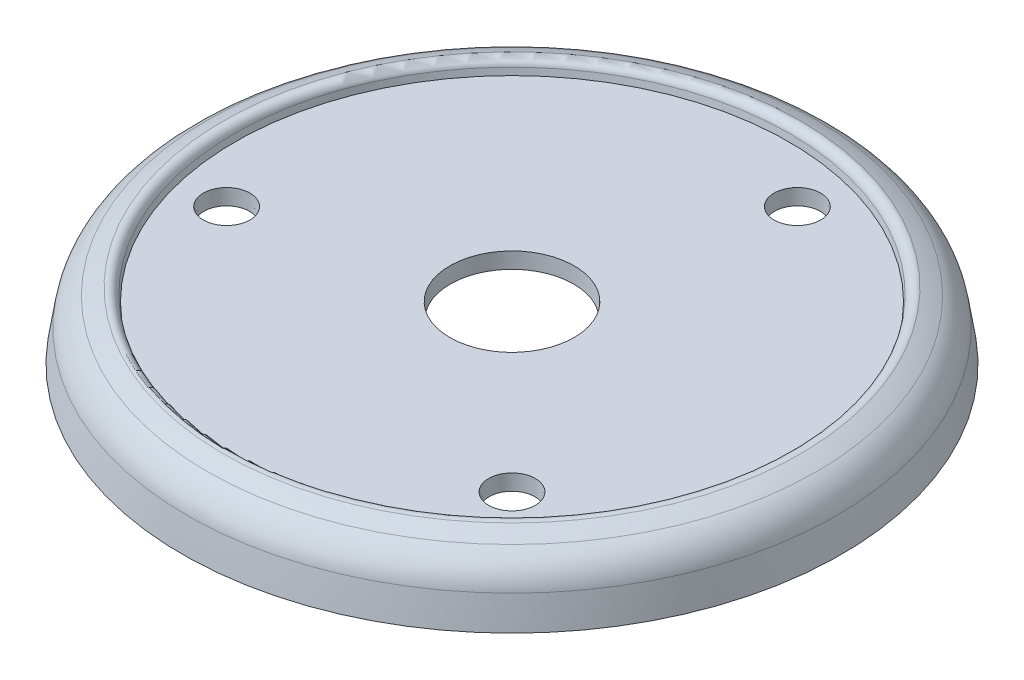
ISO-10303-21;
HEADER;
FILE_DESCRIPTION(('STEP AP214'),'2;1');
FILE_NAME('part.step','',(''),(''),'','','');
FILE_SCHEMA(('AUTOMOTIVE_DESIGN { 1 0 10303 214 1 1 1 1 }'));
ENDSEC;
DATA;
#1=APPLICATION_CONTEXT('core data for automotive mechanical design processes');
#2=APPLICATION_PROTOCOL_DEFINITION('international standard','automotive_design',2000,#1);
#3=PRODUCT_CONTEXT('',#1,'mechanical');
#4=PRODUCT('Part','Part','',(#3));
#5=PRODUCT_RELATED_PRODUCT_CATEGORY('part','',(#4));
#6=PRODUCT_DEFINITION_FORMATION('','',#4);
#7=PRODUCT_DEFINITION_CONTEXT('part definition',#1,'design');
#8=PRODUCT_DEFINITION('design','',#6,#7);
#9=PRODUCT_DEFINITION_SHAPE('','',#8);
#10=(LENGTH_UNIT() NAMED_UNIT(*) SI_UNIT(.MILLI.,.METRE.));
#11=(NAMED_UNIT(*) PLANE_ANGLE_UNIT() SI_UNIT($,.RADIAN.));
#12=(NAMED_UNIT(*) SI_UNIT($,.STERADIAN.) SOLID_ANGLE_UNIT());
#13=UNCERTAINTY_MEASURE_WITH_UNIT(LENGTH_MEASURE(1.E-05),#10,'distance_accuracy_value','');
#14=(GEOMETRIC_REPRESENTATION_CONTEXT(3) GLOBAL_UNCERTAINTY_ASSIGNED_CONTEXT((#13)) GLOBAL_UNIT_ASSIGNED_CONTEXT((#10,
#11,#12)) REPRESENTATION_CONTEXT('',''));
#15=CARTESIAN_POINT('',(0.,0.,0.));
#16=DIRECTION('',(0.,0.,1.));
#17=DIRECTION('',(1.,0.,0.));
#18=AXIS2_PLACEMENT_3D('',#15,#16,#17);
#19=CARTESIAN_POINT('',(-14.0927105043874,17.9801584610165,14.0927105043875));
#20=DIRECTION('',(0.,-1.,0.));
#21=DIRECTION('',(-0.707106781186549,0.,-0.707106781186546));
#22=AXIS2_PLACEMENT_3D('',#19,#20,#21);
#23=PLANE('',#22);
#24=CARTESIAN_POINT('',(-14.488887394336,17.9801584610165,3.88228567653791));
#25=DIRECTION('',(0.,-1.,0.));
#26=DIRECTION('',(0.,0.,-1.));
#27=AXIS2_PLACEMENT_3D('',#24,#25,#26);
#28=CIRCLE('',#27,1.46507923050825);
#29=CARTESIAN_POINT('',(-14.488887394336,17.9801584610165,2.41720644602966));
#30=VERTEX_POINT('',#29);
#31=EDGE_CURVE('E763',#30,#30,#28,.T.);
#32=ORIENTED_EDGE('',*,*,#31,.F.);
#33=EDGE_LOOP('',(#32));
#34=FACE_BOUND('',#33,.T.);
#35=CARTESIAN_POINT('',(10.6066017177983,17.9801584610165,10.6066017177981));
#36=DIRECTION('',(0.,-1.,0.));
#37=DIRECTION('',(0.,0.,-1.));
#38=AXIS2_PLACEMENT_3D('',#35,#36,#37);
#39=CIRCLE('',#38,1.46507923050825);
#40=CARTESIAN_POINT('',(10.6066017177983,17.9801584610165,9.14152248728989));
#41=VERTEX_POINT('',#40);
#42=EDGE_CURVE('E758',#41,#41,#39,.T.);
#43=ORIENTED_EDGE('',*,*,#42,.F.);
#44=EDGE_LOOP('',(#43));
#45=FACE_BOUND('',#44,.T.);
#46=CARTESIAN_POINT('',(3.88228567653772,17.9801584610165,-14.488887394336));
#47=DIRECTION('',(0.,-1.,0.));
#48=DIRECTION('',(0.,0.,-1.));
#49=AXIS2_PLACEMENT_3D('',#46,#47,#48);
#50=CIRCLE('',#49,1.46507923050825);
#51=CARTESIAN_POINT('',(3.88228567653772,17.9801584610165,-15.9539666248443));
#52=VERTEX_POINT('',#51);
#53=EDGE_CURVE('E774',#52,#52,#50,.T.);
#54=ORIENTED_EDGE('',*,*,#53,.F.);
#55=EDGE_LOOP('',(#54));
#56=FACE_BOUND('',#55,.T.);
#57=CARTESIAN_POINT('',(0.,17.9801584610165,0.));
#58=DIRECTION('',(0.,-1.,0.));
#59=DIRECTION('',(0.,0.,-1.));
#60=AXIS2_PLACEMENT_3D('',#57,#58,#59);
#61=CIRCLE('',#60,3.96507923050825);
#62=CARTESIAN_POINT('',(0.,17.9801584610165,-3.96507923050825));
#63=VERTEX_POINT('',#62);
#64=EDGE_CURVE('E165',#63,#63,#61,.T.);
#65=ORIENTED_EDGE('',*,*,#64,.F.);
#66=EDGE_LOOP('',(#65));
#67=FACE_BOUND('',#66,.T.);
#68=DIRECTION('',(0.707106781186544,0.,-0.707106781186551));
#69=VECTOR('',#68,1.);
#70=CARTESIAN_POINT('',(-7.32022800548276,17.9801584610165,-13.5427676799242));
#71=LINE('',#70,#69);
#72=CARTESIAN_POINT('',(-7.32022800548276,17.9801584610165,-13.5427676799242));
#73=VERTEX_POINT('',#72);
#74=CARTESIAN_POINT('',(-6.61312122429621,17.9801584610165,-14.2498744611108));
#75=VERTEX_POINT('',#74);
#76=EDGE_CURVE('E198',#73,#75,#71,.T.);
#77=ORIENTED_EDGE('',*,*,#76,.T.);
#78=DIRECTION('',(0.707106781186551,0.,0.707106781186544));
#79=VECTOR('',#78,1.);
#80=CARTESIAN_POINT('',(-8.73444156785587,17.9801584610165,-16.3711948046704));
#81=LINE('',#80,#79);
#82=CARTESIAN_POINT('',(-8.73444156785587,17.9801584610165,-16.3711948046704));
#83=VERTEX_POINT('',#82);
#84=EDGE_CURVE('E185',#83,#75,#81,.T.);
#85=ORIENTED_EDGE('',*,*,#84,.F.);
#86=DIRECTION('',(-0.707106781186544,0.,0.707106781186551));
#87=VECTOR('',#86,1.);
#88=CARTESIAN_POINT('',(-8.73444156785587,17.9801584610165,-16.3711948046704));
#89=LINE('',#88,#87);
#90=CARTESIAN_POINT('',(-9.44154834904241,17.9801584610165,-15.6640880234839));
#91=VERTEX_POINT('',#90);
#92=EDGE_CURVE('E202',#83,#91,#89,.T.);
#93=ORIENTED_EDGE('',*,*,#92,.T.);
#94=DIRECTION('',(0.707106781186551,0.,0.707106781186544));
#95=VECTOR('',#94,1.);
#96=CARTESIAN_POINT('',(-9.44154834904241,17.9801584610165,-15.6640880234839));
#97=LINE('',#96,#95);
#98=EDGE_CURVE('E200',#91,#73,#97,.T.);
#99=ORIENTED_EDGE('',*,*,#98,.T.);
#100=EDGE_LOOP('',(#77,#85,#93,#99));
#101=FACE_BOUND('',#100,.T.);
#102=DIRECTION('',(-0.707106781186542,0.,0.707106781186553));
#103=VECTOR('',#102,1.);
#104=CARTESIAN_POINT('',(7.32022800548275,17.9801584610165,13.5427676799243));
#105=LINE('',#104,#103);
#106=CARTESIAN_POINT('',(7.32022800548275,17.9801584610165,13.5427676799243));
#107=VERTEX_POINT('',#106);
#108=CARTESIAN_POINT('',(6.61312122429621,17.9801584610165,14.2498744611108));
#109=VERTEX_POINT('',#108);
#110=EDGE_CURVE('E262',#107,#109,#105,.T.);
#111=ORIENTED_EDGE('',*,*,#110,.T.);
#112=DIRECTION('',(-0.707106781186552,0.,-0.707106781186543));
#113=VECTOR('',#112,1.);
#114=CARTESIAN_POINT('',(8.73444156785587,17.9801584610165,16.3711948046704));
#115=LINE('',#114,#113);
#116=CARTESIAN_POINT('',(8.73444156785587,17.9801584610165,16.3711948046704));
#117=VERTEX_POINT('',#116);
#118=EDGE_CURVE('E240',#117,#109,#115,.T.);
#119=ORIENTED_EDGE('',*,*,#118,.F.);
#120=DIRECTION('',(0.707106781186542,0.,-0.707106781186553));
#121=VECTOR('',#120,1.);
#122=CARTESIAN_POINT('',(8.73444156785587,17.9801584610165,16.3711948046704));
#123=LINE('',#122,#121);
#124=CARTESIAN_POINT('',(9.44154834904241,17.9801584610165,15.6640880234839));
#125=VERTEX_POINT('',#124);
#126=EDGE_CURVE('E266',#117,#125,#123,.T.);
#127=ORIENTED_EDGE('',*,*,#126,.T.);
#128=DIRECTION('',(-0.707106781186552,0.,-0.707106781186543));
#129=VECTOR('',#128,1.);
#130=CARTESIAN_POINT('',(9.44154834904241,17.9801584610165,15.6640880234839));
#131=LINE('',#130,#129);
#132=EDGE_CURVE('E264',#125,#107,#131,.T.);
#133=ORIENTED_EDGE('',*,*,#132,.T.);
#134=EDGE_LOOP('',(#111,#119,#127,#133));
#135=FACE_BOUND('',#134,.T.);
#136=CARTESIAN_POINT('',(8.83883476483183,17.9801584610165,-8.83883476483186));
#137=DIRECTION('',(0.,-1.,0.));
#138=DIRECTION('',(-0.707106781186549,0.,-0.707106781186546));
#139=AXIS2_PLACEMENT_3D('',#136,#137,#138);
#140=CIRCLE('',#139,1.6);
#141=CARTESIAN_POINT('',(7.70746391493335,17.9801584610165,-9.97020561473034));
#142=VERTEX_POINT('',#141);
#143=EDGE_CURVE('E272',#142,#142,#140,.T.);
#144=ORIENTED_EDGE('',*,*,#143,.F.);
#145=EDGE_LOOP('',(#144));
#146=FACE_BOUND('',#145,.T.);
#147=CARTESIAN_POINT('',(-7.91959594928929,17.9801584610165,7.91959594928938));
#148=DIRECTION('',(0.,-1.,0.));
#149=DIRECTION('',(-0.707106781186549,0.,-0.707106781186546));
#150=AXIS2_PLACEMENT_3D('',#147,#148,#149);
#151=CIRCLE('',#150,4.25);
#152=CARTESIAN_POINT('',(-10.9247997693321,17.9801584610165,4.91439212924656));
#153=VERTEX_POINT('',#152);
#154=EDGE_CURVE('E294',#153,#153,#151,.T.);
#155=ORIENTED_EDGE('',*,*,#154,.F.);
#156=EDGE_LOOP('',(#155));
#157=FACE_BOUND('',#156,.T.);
#158=CARTESIAN_POINT('',(0.,17.9801584610165,0.));
#159=DIRECTION('',(0.,1.,0.));
#160=DIRECTION('',(0.707106781186549,0.,0.707106781186546));
#161=AXIS2_PLACEMENT_3D('',#158,#159,#160);
#162=CIRCLE('',#161,19.9301023259025);
#163=CARTESIAN_POINT('',(14.0927105043875,17.9801584610165,14.0927105043874));
#164=VERTEX_POINT('',#163);
#165=EDGE_CURVE('E309',#164,#164,#162,.T.);
#166=ORIENTED_EDGE('',*,*,#165,.F.);
#167=EDGE_LOOP('',(#166));
#168=FACE_BOUND('',#167,.T.);
#169=DIRECTION('',(-0.707106781186544,0.,0.707106781186551));
#170=VECTOR('',#169,1.);
#171=CARTESIAN_POINT('',(14.2498744611109,17.9801584610165,6.61312122429606));
#172=LINE('',#171,#170);
#173=CARTESIAN_POINT('',(14.2498744611109,17.9801584610165,6.61312122429606));
#174=VERTEX_POINT('',#173);
#175=CARTESIAN_POINT('',(13.5427676799243,17.9801584610165,7.32022800548261));
#176=VERTEX_POINT('',#175);
#177=EDGE_CURVE('E230',#174,#176,#172,.T.);
#178=ORIENTED_EDGE('',*,*,#177,.T.);
#179=DIRECTION('',(-0.707106781186552,0.,-0.707106781186543));
#180=VECTOR('',#179,1.);
#181=CARTESIAN_POINT('',(15.664088023484,17.9801584610165,9.44154834904224));
#182=LINE('',#181,#180);
#183=CARTESIAN_POINT('',(15.664088023484,17.9801584610165,9.44154834904224));
#184=VERTEX_POINT('',#183);
#185=EDGE_CURVE('E208',#184,#176,#182,.T.);
#186=ORIENTED_EDGE('',*,*,#185,.F.);
#187=DIRECTION('',(0.707106781186544,0.,-0.707106781186551));
#188=VECTOR('',#187,1.);
#189=CARTESIAN_POINT('',(15.664088023484,17.9801584610165,9.44154834904224));
#190=LINE('',#189,#188);
#191=CARTESIAN_POINT('',(16.3711948046705,17.9801584610165,8.73444156785569));
#192=VERTEX_POINT('',#191);
#193=EDGE_CURVE('E234',#184,#192,#190,.T.);
#194=ORIENTED_EDGE('',*,*,#193,.T.);
#195=DIRECTION('',(-0.707106781186552,0.,-0.707106781186543));
#196=VECTOR('',#195,1.);
#197=CARTESIAN_POINT('',(16.3711948046705,17.9801584610165,8.73444156785569));
#198=LINE('',#197,#196);
#199=EDGE_CURVE('E232',#192,#174,#198,.T.);
#200=ORIENTED_EDGE('',*,*,#199,.T.);
#201=EDGE_LOOP('',(#178,#186,#194,#200));
#202=FACE_BOUND('',#201,.T.);
#203=DIRECTION('',(0.707106781186544,0.,-0.707106781186551));
#204=VECTOR('',#203,1.);
#205=CARTESIAN_POINT('',(-14.2498744611109,17.9801584610165,-6.61312122429606));
#206=LINE('',#205,#204);
#207=CARTESIAN_POINT('',(-14.2498744611109,17.9801584610165,-6.61312122429606));
#208=VERTEX_POINT('',#207);
#209=CARTESIAN_POINT('',(-13.5427676799243,17.9801584610165,-7.32022800548261));
#210=VERTEX_POINT('',#209);
#211=EDGE_CURVE('E63',#208,#210,#206,.T.);
#212=ORIENTED_EDGE('',*,*,#211,.T.);
#213=DIRECTION('',(0.707106781186552,0.,0.707106781186543));
#214=VECTOR('',#213,1.);
#215=CARTESIAN_POINT('',(-15.664088023484,17.9801584610165,-9.44154834904224));
#216=LINE('',#215,#214);
#217=CARTESIAN_POINT('',(-15.664088023484,17.9801584610165,-9.44154834904224));
#218=VERTEX_POINT('',#217);
#219=EDGE_CURVE('E158',#218,#210,#216,.T.);
#220=ORIENTED_EDGE('',*,*,#219,.F.);
#221=DIRECTION('',(-0.707106781186544,0.,0.707106781186551));
#222=VECTOR('',#221,1.);
#223=CARTESIAN_POINT('',(-15.664088023484,17.9801584610165,-9.44154834904224));
#224=LINE('',#223,#222);
#225=CARTESIAN_POINT('',(-16.3711948046705,17.9801584610165,-8.73444156785569));
#226=VERTEX_POINT('',#225);
#227=EDGE_CURVE('E161',#218,#226,#224,.T.);
#228=ORIENTED_EDGE('',*,*,#227,.T.);
#229=DIRECTION('',(0.707106781186552,0.,0.707106781186543));
#230=VECTOR('',#229,1.);
#231=CARTESIAN_POINT('',(-16.3711948046705,17.9801584610165,-8.73444156785569));
#232=LINE('',#231,#230);
#233=EDGE_CURVE('E68',#226,#208,#232,.T.);
#234=ORIENTED_EDGE('',*,*,#233,.T.);
#235=EDGE_LOOP('',(#212,#220,#228,#234));
#236=FACE_BOUND('',#235,.T.);
#237=ADVANCED_FACE('F48',(#34,#45,#56,#67,#101,#135,#146,#157,#168,#202,#236),#23,.T.);
#238=CARTESIAN_POINT('',(0.,15.4972218473621,0.));
#239=DIRECTION('',(0.,-1.,0.));
#240=DIRECTION('',(-0.707106781186549,0.,-0.707106781186546));
#241=AXIS2_PLACEMENT_3D('',#238,#239,#240);
#242=CONICAL_SURFACE('',#241,21.2162018026182,1.55334303427494);
#243=CARTESIAN_POINT('',(0.,15.509149303606,0.));
#244=DIRECTION('',(0.,1.,0.));
#245=DIRECTION('',(0.707106781186549,0.,0.707106781186546));
#246=AXIS2_PLACEMENT_3D('',#243,#244,#245);
#247=CIRCLE('',#246,20.53287829205);
#248=CARTESIAN_POINT('',(14.5189374775867,15.509149303606,14.5189374775866));
#249=VERTEX_POINT('',#248);
#250=EDGE_CURVE('E300',#249,#249,#247,.T.);
#251=ORIENTED_EDGE('',*,*,#250,.T.);
#252=EDGE_LOOP('',(#251));
#253=FACE_BOUND('',#252,.T.);
#254=CARTESIAN_POINT('',(0.,15.4972218473621,0.));
#255=DIRECTION('',(0.,1.,0.));
#256=DIRECTION('',(0.707106781186549,0.,0.707106781186546));
#257=AXIS2_PLACEMENT_3D('',#254,#255,#256);
#258=CIRCLE('',#257,21.2162018026182);
#259=CARTESIAN_POINT('',(15.0021201656536,15.4972218473621,15.0021201656535));
#260=VERTEX_POINT('',#259);
#261=EDGE_CURVE('E321',#260,#260,#258,.T.);
#262=ORIENTED_EDGE('',*,*,#261,.F.);
#263=EDGE_LOOP('',(#262));
#264=FACE_BOUND('',#263,.T.);
#265=ADVANCED_FACE('F343',(#253,#264),#242,.F.);
#266=CARTESIAN_POINT('',(0.,-2.08273608552745,0.));
#267=DIRECTION('',(0.,1.,0.));
#268=DIRECTION('',(0.707106781186549,0.,0.707106781186546));
#269=AXIS2_PLACEMENT_3D('',#266,#267,#268);
#270=DEGENERATE_TOROIDAL_SURFACE('',#269,96.8198704269137,119.338046189375,.F.);
#271=ORIENTED_EDGE('',*,*,#261,.T.);
#272=EDGE_LOOP('',(#271));
#273=FACE_BOUND('',#272,.T.);
#274=CARTESIAN_POINT('',(0.,17.5030459363504,0.));
#275=DIRECTION('',(0.,1.,0.));
#276=DIRECTION('',(0.707106781186549,0.,0.707106781186546));
#277=AXIS2_PLACEMENT_3D('',#274,#275,#276);
#278=CIRCLE('',#277,20.8999937035249);
#279=CARTESIAN_POINT('',(14.7785272745186,17.5030459363504,14.7785272745186));
#280=VERTEX_POINT('',#279);
#281=EDGE_CURVE('E318',#280,#280,#278,.T.);
#282=ORIENTED_EDGE('',*,*,#281,.F.);
#283=EDGE_LOOP('',(#282));
#284=FACE_BOUND('',#283,.T.);
#285=ADVANCED_FACE('F349',(#273,#284),#270,.F.);
#286=CARTESIAN_POINT('',(0.,17.0927454779618,0.));
#287=DIRECTION('',(0.,1.,0.));
#288=DIRECTION('',(0.707106781186549,0.,0.707106781186546));
#289=AXIS2_PLACEMENT_3D('',#286,#287,#288);
#290=TOROIDAL_SURFACE('',#289,18.4338928268684,2.49999999999998);
#291=ORIENTED_EDGE('',*,*,#281,.T.);
#292=EDGE_LOOP('',(#291));
#293=FACE_BOUND('',#292,.T.);
#294=CARTESIAN_POINT('',(0.,19.301849694765,0.));
#295=DIRECTION('',(0.,1.,0.));
#296=DIRECTION('',(0.707106781186549,0.,0.707106781186546));
#297=AXIS2_PLACEMENT_3D('',#294,#295,#296);
#298=CIRCLE('',#297,19.6043023959093);
#299=CARTESIAN_POINT('',(13.8623351645792,19.301849694765,13.8623351645791));
#300=VERTEX_POINT('',#299);
#301=EDGE_CURVE('E315',#300,#300,#298,.T.);
#302=ORIENTED_EDGE('',*,*,#301,.F.);
#303=EDGE_LOOP('',(#302));
#304=FACE_BOUND('',#303,.T.);
#305=ADVANCED_FACE('F367',(#293,#304),#290,.T.);
#306=CARTESIAN_POINT('',(0.,10.4654328275525,0.));
#307=DIRECTION('',(0.,1.,0.));
#308=DIRECTION('',(0.707106781186549,0.,0.707106781186546));
#309=AXIS2_PLACEMENT_3D('',#306,#307,#308);
#310=TOROIDAL_SURFACE('',#309,14.9226641197455,10.);
#311=CARTESIAN_POINT('',(0.,19.7757461865793,0.));
#312=DIRECTION('',(0.,-1.,0.));
#313=DIRECTION('',(0.,0.,-1.));
#314=AXIS2_PLACEMENT_3D('',#311,#312,#313);
#315=CIRCLE('',#314,18.5720565564021);
#316=CARTESIAN_POINT('',(0.,19.7757461865793,-18.5720565564021));
#317=VERTEX_POINT('',#316);
#318=EDGE_CURVE('E13',#317,#317,#315,.T.);
#319=ORIENTED_EDGE('',*,*,#318,.T.);
#320=EDGE_LOOP('',(#319));
#321=FACE_BOUND('',#320,.T.);
#322=ORIENTED_EDGE('',*,*,#301,.T.);
#323=EDGE_LOOP('',(#322));
#324=FACE_BOUND('',#323,.T.);
#325=ADVANCED_FACE('F364',(#321,#324),#310,.T.);
#326=CARTESIAN_POINT('',(0.,18.9801584610165,0.));
#327=DIRECTION('',(0.,1.,0.));
#328=DIRECTION('',(0.707106781186549,0.,0.707106781186546));
#329=AXIS2_PLACEMENT_3D('',#326,#327,#328);
#330=CONICAL_SURFACE('',#329,17.8236730192915,0.174532925199431);
#331=CARTESIAN_POINT('',(0.,19.3970546074614,0.));
#332=DIRECTION('',(0.,-1.,0.));
#333=DIRECTION('',(0.,0.,-1.));
#334=AXIS2_PLACEMENT_3D('',#331,#332,#333);
#335=CIRCLE('',#334,17.8971830580632);
#336=CARTESIAN_POINT('',(0.,19.3970546074614,-17.8971830580632));
#337=VERTEX_POINT('',#336);
#338=EDGE_CURVE('E56',#337,#337,#335,.F.);
#339=ORIENTED_EDGE('',*,*,#338,.T.);
#340=EDGE_LOOP('',(#339));
#341=FACE_BOUND('',#340,.T.);
#342=CARTESIAN_POINT('',(0.,18.9801584610165,0.));
#343=DIRECTION('',(0.,1.,0.));
#344=DIRECTION('',(0.707106781186549,0.,0.707106781186546));
#345=AXIS2_PLACEMENT_3D('',#342,#343,#344);
#346=CIRCLE('',#345,17.8236730192915);
#347=CARTESIAN_POINT('',(12.6032400575928,18.9801584610165,12.6032400575927));
#348=VERTEX_POINT('',#347);
#349=EDGE_CURVE('E312',#348,#348,#346,.T.);
#350=ORIENTED_EDGE('',*,*,#349,.F.);
#351=EDGE_LOOP('',(#350));
#352=FACE_BOUND('',#351,.T.);
#353=ADVANCED_FACE('F329',(#341,#352),#330,.F.);
#354=CARTESIAN_POINT('',(-12.6032400575927,18.9801584610165,12.6032400575928));
#355=DIRECTION('',(0.,1.,0.));
#356=DIRECTION('',(0.707106781186549,0.,0.707106781186546));
#357=AXIS2_PLACEMENT_3D('',#354,#355,#356);
#358=PLANE('',#357);
#359=CARTESIAN_POINT('',(-14.488887394336,18.9801584610165,3.88228567653791));
#360=DIRECTION('',(0.,1.,0.));
#361=DIRECTION('',(0.,0.,1.));
#362=AXIS2_PLACEMENT_3D('',#359,#360,#361);
#363=CIRCLE('',#362,1.5);
#364=CARTESIAN_POINT('',(-14.488887394336,18.9801584610165,5.38228567653791));
#365=VERTEX_POINT('',#364);
#366=EDGE_CURVE('E768',#365,#365,#363,.T.);
#367=ORIENTED_EDGE('',*,*,#366,.F.);
#368=EDGE_LOOP('',(#367));
#369=FACE_BOUND('',#368,.T.);
#370=CARTESIAN_POINT('',(10.6066017177983,18.9801584610165,10.6066017177981));
#371=DIRECTION('',(0.,1.,0.));
#372=DIRECTION('',(0.,0.,1.));
#373=AXIS2_PLACEMENT_3D('',#370,#371,#372);
#374=CIRCLE('',#373,1.5);
#375=CARTESIAN_POINT('',(10.6066017177983,18.9801584610165,12.1066017177981));
#376=VERTEX_POINT('',#375);
#377=EDGE_CURVE('E761',#376,#376,#374,.T.);
#378=ORIENTED_EDGE('',*,*,#377,.F.);
#379=EDGE_LOOP('',(#378));
#380=FACE_BOUND('',#379,.T.);
#381=CARTESIAN_POINT('',(3.88228567653772,18.9801584610165,-14.488887394336));
#382=DIRECTION('',(0.,1.,0.));
#383=DIRECTION('',(0.,0.,1.));
#384=AXIS2_PLACEMENT_3D('',#381,#382,#383);
#385=CIRCLE('',#384,1.5);
#386=CARTESIAN_POINT('',(3.88228567653772,18.9801584610165,-12.9888873943361));
#387=VERTEX_POINT('',#386);
#388=EDGE_CURVE('E765',#387,#387,#385,.T.);
#389=ORIENTED_EDGE('',*,*,#388,.F.);
#390=EDGE_LOOP('',(#389));
#391=FACE_BOUND('',#390,.T.);
#392=CARTESIAN_POINT('',(0.,18.9801584610165,0.));
#393=DIRECTION('',(0.,1.,0.));
#394=DIRECTION('',(0.,0.,1.));
#395=AXIS2_PLACEMENT_3D('',#392,#393,#394);
#396=CIRCLE('',#395,4.);
#397=CARTESIAN_POINT('',(0.,18.9801584610165,4.));
#398=VERTEX_POINT('',#397);
#399=EDGE_CURVE('E777',#398,#398,#396,.T.);
#400=ORIENTED_EDGE('',*,*,#399,.F.);
#401=EDGE_LOOP('',(#400));
#402=FACE_BOUND('',#401,.T.);
#403=ORIENTED_EDGE('',*,*,#349,.T.);
#404=EDGE_LOOP('',(#403));
#405=FACE_BOUND('',#404,.T.);
#406=ADVANCED_FACE('F358',(#369,#380,#391,#402,#405),#358,.T.);
#407=CARTESIAN_POINT('',(0.,16.8812829793378,0.));
#408=DIRECTION('',(0.,-1.,0.));
#409=DIRECTION('',(-0.707106781186549,0.,-0.707106781186546));
#410=AXIS2_PLACEMENT_3D('',#407,#408,#409);
#411=CONICAL_SURFACE('',#410,20.2245451238007,0.26179938779915);
#412=ORIENTED_EDGE('',*,*,#165,.T.);
#413=EDGE_LOOP('',(#412));
#414=FACE_BOUND('',#413,.T.);
#415=CARTESIAN_POINT('',(0.,16.8812829793378,0.));
#416=DIRECTION('',(0.,1.,0.));
#417=DIRECTION('',(0.707106781186549,0.,0.707106781186546));
#418=AXIS2_PLACEMENT_3D('',#415,#416,#417);
#419=CIRCLE('',#418,20.2245451238007);
#420=CARTESIAN_POINT('',(14.3009130034528,16.8812829793378,14.3009130034528));
#421=VERTEX_POINT('',#420);
#422=EDGE_CURVE('E306',#421,#421,#419,.T.);
#423=ORIENTED_EDGE('',*,*,#422,.F.);
#424=EDGE_LOOP('',(#423));
#425=FACE_BOUND('',#424,.T.);
#426=ADVANCED_FACE('F356',(#414,#425),#411,.F.);
#427=CARTESIAN_POINT('',(0.,16.8729212883777,0.));
#428=DIRECTION('',(0.,1.,0.));
#429=DIRECTION('',(0.707106781186549,0.,0.707106781186546));
#430=AXIS2_PLACEMENT_3D('',#427,#428,#429);
#431=CONICAL_SURFACE('',#430,19.7455041695289,1.55334303427494);
#432=ORIENTED_EDGE('',*,*,#422,.T.);
#433=EDGE_LOOP('',(#432));
#434=FACE_BOUND('',#433,.T.);
#435=CARTESIAN_POINT('',(0.,16.8729212883777,0.));
#436=DIRECTION('',(0.,1.,0.));
#437=DIRECTION('',(0.707106781186549,0.,0.707106781186546));
#438=AXIS2_PLACEMENT_3D('',#435,#436,#437);
#439=CIRCLE('',#438,19.7455041695289);
#440=CARTESIAN_POINT('',(13.9621798962211,16.8729212883777,13.9621798962211));
#441=VERTEX_POINT('',#440);
#442=EDGE_CURVE('E303',#441,#441,#439,.T.);
#443=ORIENTED_EDGE('',*,*,#442,.F.);
#444=EDGE_LOOP('',(#443));
#445=FACE_BOUND('',#444,.T.);
#446=ADVANCED_FACE('F460',(#434,#445),#431,.F.);
#447=CARTESIAN_POINT('',(0.,15.509149303606,0.));
#448=DIRECTION('',(0.,-1.,0.));
#449=DIRECTION('',(-0.707106781186549,0.,-0.707106781186546));
#450=AXIS2_PLACEMENT_3D('',#447,#448,#449);
#451=CONICAL_SURFACE('',#450,20.53287829205,0.523598775598298);
#452=ORIENTED_EDGE('',*,*,#442,.T.);
#453=EDGE_LOOP('',(#452));
#454=FACE_BOUND('',#453,.T.);
#455=ORIENTED_EDGE('',*,*,#250,.F.);
#456=EDGE_LOOP('',(#455));
#457=FACE_BOUND('',#456,.T.);
#458=ADVANCED_FACE('F457',(#454,#457),#451,.F.);
#459=CARTESIAN_POINT('',(-7.91959594928929,17.9801584610165,7.91959594928938));
#460=DIRECTION('',(0.,-1.,0.));
#461=DIRECTION('',(-0.707106781186549,0.,-0.707106781186546));
#462=AXIS2_PLACEMENT_3D('',#459,#460,#461);
#463=CONICAL_SURFACE('',#462,4.25,0.0349065850398867);
#464=CARTESIAN_POINT('',(-7.91959594928929,18.4801584610165,7.91959594928938));
#465=DIRECTION('',(0.,-1.,0.));
#466=DIRECTION('',(-0.707106781186549,0.,-0.707106781186546));
#467=AXIS2_PLACEMENT_3D('',#464,#465,#466);
#468=CIRCLE('',#467,4.23253961525413);
#469=CARTESIAN_POINT('',(-10.9124534128762,18.4801584610165,4.92673848570249));
#470=VERTEX_POINT('',#469);
#471=EDGE_CURVE('E297',#470,#470,#468,.T.);
#472=ORIENTED_EDGE('',*,*,#471,.F.);
#473=EDGE_LOOP('',(#472));
#474=FACE_BOUND('',#473,.T.);
#475=ORIENTED_EDGE('',*,*,#154,.T.);
#476=EDGE_LOOP('',(#475));
#477=FACE_BOUND('',#476,.T.);
#478=ADVANCED_FACE('F453',(#474,#477),#463,.F.);
#479=CARTESIAN_POINT('',(-7.91959594928929,18.4801584610165,7.91959594928938));
#480=DIRECTION('',(0.,-1.,0.));
#481=DIRECTION('',(-0.707106781186549,0.,-0.707106781186546));
#482=AXIS2_PLACEMENT_3D('',#479,#480,#481);
#483=PLANE('',#482);
#484=ORIENTED_EDGE('',*,*,#471,.T.);
#485=EDGE_LOOP('',(#484));
#486=FACE_BOUND('',#485,.T.);
#487=ADVANCED_FACE('F386',(#486),#483,.T.);
#488=CARTESIAN_POINT('',(8.83883476483183,18.7801584610165,-8.83883476483186));
#489=DIRECTION('',(0.,-1.,0.));
#490=DIRECTION('',(-0.707106781186549,0.,-0.707106781186546));
#491=AXIS2_PLACEMENT_3D('',#488,#489,#490);
#492=PLANE('',#491);
#493=CARTESIAN_POINT('',(8.83883476483183,18.7801584610165,-8.83883476483186));
#494=DIRECTION('',(0.,-1.,0.));
#495=DIRECTION('',(-0.707106781186549,0.,-0.707106781186546));
#496=AXIS2_PLACEMENT_3D('',#493,#494,#495);
#497=CIRCLE('',#496,0.620204102886731);
#498=CARTESIAN_POINT('',(8.4002842379609,18.7801584610165,-9.27738529170279));
#499=VERTEX_POINT('',#498);
#500=EDGE_CURVE('E324',#499,#499,#497,.T.);
#501=ORIENTED_EDGE('',*,*,#500,.T.);
#502=EDGE_LOOP('',(#501));
#503=FACE_BOUND('',#502,.T.);
#504=ADVANCED_FACE('F377',(#503),#492,.T.);
#505=CARTESIAN_POINT('',(8.83883476483183,17.7801584610165,-8.83883476483186));
#506=DIRECTION('',(0.,1.,0.));
#507=DIRECTION('',(0.707106781186549,0.,0.707106781186546));
#508=AXIS2_PLACEMENT_3D('',#505,#506,#507);
#509=DEGENERATE_TOROIDAL_SURFACE('',#508,0.620204102886731,1.,.T.);
#510=ORIENTED_EDGE('',*,*,#143,.T.);
#511=EDGE_LOOP('',(#510));
#512=FACE_BOUND('',#511,.T.);
#513=ORIENTED_EDGE('',*,*,#500,.F.);
#514=EDGE_LOOP('',(#513));
#515=FACE_BOUND('',#514,.T.);
#516=ADVANCED_FACE('F374',(#512,#515),#509,.F.);
#517=CARTESIAN_POINT('',(8.73444156785587,17.9801584610165,16.3711948046704));
#518=DIRECTION('',(-0.70667603084083,-0.034899496702501,0.706676030840839));
#519=DIRECTION('',(0.707106781186552,0.,0.707106781186543));
#520=AXIS2_PLACEMENT_3D('',#517,#518,#519);
#521=PLANE('',#520);
#522=ORIENTED_EDGE('',*,*,#118,.T.);
#523=DIRECTION('',(0.0493253122022785,-0.998782765958718,0.));
#524=VECTOR('',#523,1.);
#525=CARTESIAN_POINT('',(6.61828236789273,17.8756510378155,14.2498744611108));
#526=LINE('',#525,#524);
#527=CARTESIAN_POINT('',(6.76127750176741,14.9801584610165,14.2498744611108));
#528=VERTEX_POINT('',#527);
#529=EDGE_CURVE('E269',#528,#109,#526,.F.);
#530=ORIENTED_EDGE('',*,*,#529,.F.);
#531=DIRECTION('',(0.707106781186552,0.,0.707106781186543));
#532=VECTOR('',#531,1.);
#533=CARTESIAN_POINT('',(-3.74429847967174,14.9801584610165,3.74429847967178));
#534=LINE('',#533,#532);
#535=CARTESIAN_POINT('',(8.73444156785587,14.9801584610165,16.2230385271992));
#536=VERTEX_POINT('',#535);
#537=EDGE_CURVE('E268',#536,#528,#534,.F.);
#538=ORIENTED_EDGE('',*,*,#537,.F.);
#539=DIRECTION('',(0.,-0.998782765958718,-0.0493253122022785));
#540=VECTOR('',#539,1.);
#541=CARTESIAN_POINT('',(8.73444156785587,17.9801584610165,16.3711948046704));
#542=LINE('',#541,#540);
#543=EDGE_CURVE('E274',#536,#117,#542,.F.);
#544=ORIENTED_EDGE('',*,*,#543,.T.);
#545=EDGE_LOOP('',(#522,#530,#538,#544));
#546=FACE_BOUND('',#545,.T.);
#547=ADVANCED_FACE('F376',(#546),#521,.T.);
#548=CARTESIAN_POINT('',(7.32022800548275,17.9801584610165,13.5427676799243));
#549=DIRECTION('',(-0.70667603084084,-0.034899496702501,-0.706676030840829));
#550=DIRECTION('',(-0.707106781186542,0.,0.707106781186553));
#551=AXIS2_PLACEMENT_3D('',#548,#549,#550);
#552=PLANE('',#551);
#553=ORIENTED_EDGE('',*,*,#110,.F.);
#554=DIRECTION('',(0.,0.998782765958718,-0.0493253122022785));
#555=VECTOR('',#554,1.);
#556=CARTESIAN_POINT('',(7.32022800548275,17.8756510378155,13.5479288235208));
#557=LINE('',#556,#555);
#558=CARTESIAN_POINT('',(7.32022800548275,14.9801584610165,13.6909239573955));
#559=VERTEX_POINT('',#558);
#560=EDGE_CURVE('E273',#559,#107,#557,.T.);
#561=ORIENTED_EDGE('',*,*,#560,.F.);
#562=DIRECTION('',(-0.707106781186542,0.,0.707106781186553));
#563=VECTOR('',#562,1.);
#564=CARTESIAN_POINT('',(10.5055759814392,14.9801584610165,10.505575981439));
#565=LINE('',#564,#563);
#566=EDGE_CURVE('E284',#559,#528,#565,.T.);
#567=ORIENTED_EDGE('',*,*,#566,.T.);
#568=ORIENTED_EDGE('',*,*,#529,.T.);
#569=EDGE_LOOP('',(#553,#561,#567,#568));
#570=FACE_BOUND('',#569,.T.);
#571=ADVANCED_FACE('F383',(#570),#552,.T.);
#572=CARTESIAN_POINT('',(9.44154834904241,17.9801584610165,15.6640880234839));
#573=DIRECTION('',(0.70667603084083,-0.034899496702501,-0.706676030840839));
#574=DIRECTION('',(-0.707106781186552,0.,-0.707106781186543));
#575=AXIS2_PLACEMENT_3D('',#572,#573,#574);
#576=PLANE('',#575);
#577=ORIENTED_EDGE('',*,*,#132,.F.);
#578=DIRECTION('',(0.0493253122022785,0.998782765958718,0.));
#579=VECTOR('',#578,1.);
#580=CARTESIAN_POINT('',(9.43982796784357,17.9453226532829,15.6640880234839));
#581=LINE('',#580,#579);
#582=CARTESIAN_POINT('',(9.29339207157121,14.9801584610165,15.6640880234839));
#583=VERTEX_POINT('',#582);
#584=EDGE_CURVE('E277',#583,#125,#581,.T.);
#585=ORIENTED_EDGE('',*,*,#584,.F.);
#586=DIRECTION('',(-0.707106781186552,0.,-0.707106781186543));
#587=VECTOR('',#586,1.);
#588=CARTESIAN_POINT('',(-3.1853479759564,14.9801584610165,3.18534797595644));
#589=LINE('',#588,#587);
#590=EDGE_CURVE('E287',#583,#559,#589,.T.);
#591=ORIENTED_EDGE('',*,*,#590,.T.);
#592=ORIENTED_EDGE('',*,*,#560,.T.);
#593=EDGE_LOOP('',(#577,#585,#591,#592));
#594=FACE_BOUND('',#593,.T.);
#595=ADVANCED_FACE('F443',(#594),#576,.T.);
#596=CARTESIAN_POINT('',(8.73444156785587,17.9801584610165,16.3711948046704));
#597=DIRECTION('',(0.70667603084084,-0.034899496702501,0.706676030840829));
#598=DIRECTION('',(0.707106781186542,0.,-0.707106781186553));
#599=AXIS2_PLACEMENT_3D('',#596,#597,#598);
#600=PLANE('',#599);
#601=ORIENTED_EDGE('',*,*,#126,.F.);
#602=ORIENTED_EDGE('',*,*,#543,.F.);
#603=DIRECTION('',(0.707106781186542,0.,-0.707106781186553));
#604=VECTOR('',#603,1.);
#605=CARTESIAN_POINT('',(12.4787400475276,14.9801584610165,12.4787400475274));
#606=LINE('',#605,#604);
#607=EDGE_CURVE('E278',#536,#583,#606,.T.);
#608=ORIENTED_EDGE('',*,*,#607,.T.);
#609=ORIENTED_EDGE('',*,*,#584,.T.);
#610=EDGE_LOOP('',(#601,#602,#608,#609));
#611=FACE_BOUND('',#610,.T.);
#612=ADVANCED_FACE('F438',(#611),#600,.T.);
#613=CARTESIAN_POINT('',(0.,14.9801584610165,0.));
#614=DIRECTION('',(0.,1.,0.));
#615=DIRECTION('',(-1.,0.,0.));
#616=AXIS2_PLACEMENT_3D('',#613,#614,#615);
#617=PLANE('',#616);
#618=ORIENTED_EDGE('',*,*,#537,.T.);
#619=ORIENTED_EDGE('',*,*,#566,.F.);
#620=ORIENTED_EDGE('',*,*,#590,.F.);
#621=ORIENTED_EDGE('',*,*,#607,.F.);
#622=EDGE_LOOP('',(#618,#619,#620,#621));
#623=FACE_BOUND('',#622,.T.);
#624=ADVANCED_FACE('F431',(#623),#617,.F.);
#625=CARTESIAN_POINT('',(15.664088023484,17.9801584610165,9.44154834904224));
#626=DIRECTION('',(-0.70667603084083,-0.034899496702501,0.706676030840839));
#627=DIRECTION('',(0.707106781186552,0.,0.707106781186543));
#628=AXIS2_PLACEMENT_3D('',#625,#626,#627);
#629=PLANE('',#628);
#630=ORIENTED_EDGE('',*,*,#185,.T.);
#631=DIRECTION('',(0.0493253122022785,-0.998782765958718,0.));
#632=VECTOR('',#631,1.);
#633=CARTESIAN_POINT('',(13.5479288235209,17.8756510378155,7.32022800548261));
#634=LINE('',#633,#632);
#635=CARTESIAN_POINT('',(13.6909239573955,14.9801584610165,7.32022800548261));
#636=VERTEX_POINT('',#635);
#637=EDGE_CURVE('E237',#636,#176,#634,.F.);
#638=ORIENTED_EDGE('',*,*,#637,.F.);
#639=DIRECTION('',(0.707106781186552,0.,0.707106781186543));
#640=VECTOR('',#639,1.);
#641=CARTESIAN_POINT('',(3.18534797595639,14.9801584610165,-3.18534797595642));
#642=LINE('',#641,#640);
#643=CARTESIAN_POINT('',(15.664088023484,14.9801584610165,9.29339207157104));
#644=VERTEX_POINT('',#643);
#645=EDGE_CURVE('E236',#644,#636,#642,.F.);
#646=ORIENTED_EDGE('',*,*,#645,.F.);
#647=DIRECTION('',(0.,-0.998782765958718,-0.0493253122022785));
#648=VECTOR('',#647,1.);
#649=CARTESIAN_POINT('',(15.664088023484,17.9801584610165,9.44154834904224));
#650=LINE('',#649,#648);
#651=EDGE_CURVE('E242',#644,#184,#650,.F.);
#652=ORIENTED_EDGE('',*,*,#651,.T.);
#653=EDGE_LOOP('',(#630,#638,#646,#652));
#654=FACE_BOUND('',#653,.T.);
#655=ADVANCED_FACE('F406',(#654),#629,.T.);
#656=CARTESIAN_POINT('',(14.2498744611109,17.9801584610165,6.61312122429606));
#657=DIRECTION('',(-0.706676030840838,-0.034899496702501,-0.706676030840831));
#658=DIRECTION('',(-0.707106781186544,0.,0.707106781186551));
#659=AXIS2_PLACEMENT_3D('',#656,#657,#658);
#660=PLANE('',#659);
#661=ORIENTED_EDGE('',*,*,#177,.F.);
#662=DIRECTION('',(0.,0.998782765958718,-0.0493253122022785));
#663=VECTOR('',#662,1.);
#664=CARTESIAN_POINT('',(14.2498744611109,17.8756510378155,6.61828236789258));
#665=LINE('',#664,#663);
#666=CARTESIAN_POINT('',(14.2498744611109,14.9801584610165,6.76127750176726));
#667=VERTEX_POINT('',#666);
#668=EDGE_CURVE('E241',#667,#174,#665,.T.);
#669=ORIENTED_EDGE('',*,*,#668,.F.);
#670=DIRECTION('',(-0.707106781186544,0.,0.707106781186551));
#671=VECTOR('',#670,1.);
#672=CARTESIAN_POINT('',(10.5055759814391,14.9801584610165,10.505575981439));
#673=LINE('',#672,#671);
#674=EDGE_CURVE('E252',#667,#636,#673,.T.);
#675=ORIENTED_EDGE('',*,*,#674,.T.);
#676=ORIENTED_EDGE('',*,*,#637,.T.);
#677=EDGE_LOOP('',(#661,#669,#675,#676));
#678=FACE_BOUND('',#677,.T.);
#679=ADVANCED_FACE('F402',(#678),#660,.T.);
#680=CARTESIAN_POINT('',(16.3711948046705,17.9801584610165,8.73444156785569));
#681=DIRECTION('',(0.70667603084083,-0.034899496702501,-0.706676030840839));
#682=DIRECTION('',(-0.707106781186552,0.,-0.707106781186543));
#683=AXIS2_PLACEMENT_3D('',#680,#681,#682);
#684=PLANE('',#683);
#685=ORIENTED_EDGE('',*,*,#199,.F.);
#686=DIRECTION('',(0.0493253122022785,0.998782765958718,0.));
#687=VECTOR('',#686,1.);
#688=CARTESIAN_POINT('',(16.3694744234717,17.9453226532829,8.73444156785569));
#689=LINE('',#688,#687);
#690=CARTESIAN_POINT('',(16.2230385271993,14.9801584610165,8.73444156785569));
#691=VERTEX_POINT('',#690);
#692=EDGE_CURVE('E245',#691,#192,#689,.T.);
#693=ORIENTED_EDGE('',*,*,#692,.F.);
#694=DIRECTION('',(-0.707106781186552,0.,-0.707106781186543));
#695=VECTOR('',#694,1.);
#696=CARTESIAN_POINT('',(3.74429847967173,14.9801584610165,-3.74429847967177));
#697=LINE('',#696,#695);
#698=EDGE_CURVE('E255',#691,#667,#697,.T.);
#699=ORIENTED_EDGE('',*,*,#698,.T.);
#700=ORIENTED_EDGE('',*,*,#668,.T.);
#701=EDGE_LOOP('',(#685,#693,#699,#700));
#702=FACE_BOUND('',#701,.T.);
#703=ADVANCED_FACE('F413',(#702),#684,.T.);
#704=CARTESIAN_POINT('',(15.664088023484,17.9801584610165,9.44154834904224));
#705=DIRECTION('',(0.706676030840838,-0.034899496702501,0.706676030840831));
#706=DIRECTION('',(0.707106781186544,0.,-0.707106781186551));
#707=AXIS2_PLACEMENT_3D('',#704,#705,#706);
#708=PLANE('',#707);
#709=ORIENTED_EDGE('',*,*,#193,.F.);
#710=ORIENTED_EDGE('',*,*,#651,.F.);
#711=DIRECTION('',(0.707106781186544,0.,-0.707106781186551));
#712=VECTOR('',#711,1.);
#713=CARTESIAN_POINT('',(12.4787400475276,14.9801584610165,12.4787400475275));
#714=LINE('',#713,#712);
#715=EDGE_CURVE('E246',#644,#691,#714,.T.);
#716=ORIENTED_EDGE('',*,*,#715,.T.);
#717=ORIENTED_EDGE('',*,*,#692,.T.);
#718=EDGE_LOOP('',(#709,#710,#716,#717));
#719=FACE_BOUND('',#718,.T.);
#720=ADVANCED_FACE('F410',(#719),#708,.T.);
#721=CARTESIAN_POINT('',(0.,14.9801584610165,0.));
#722=DIRECTION('',(0.,1.,0.));
#723=DIRECTION('',(-1.,0.,0.));
#724=AXIS2_PLACEMENT_3D('',#721,#722,#723);
#725=PLANE('',#724);
#726=ORIENTED_EDGE('',*,*,#645,.T.);
#727=ORIENTED_EDGE('',*,*,#674,.F.);
#728=ORIENTED_EDGE('',*,*,#698,.F.);
#729=ORIENTED_EDGE('',*,*,#715,.F.);
#730=EDGE_LOOP('',(#726,#727,#728,#729));
#731=FACE_BOUND('',#730,.T.);
#732=ADVANCED_FACE('F415',(#731),#725,.F.);
#733=CARTESIAN_POINT('',(-8.73444156785587,17.9801584610165,-16.3711948046704));
#734=DIRECTION('',(0.706676030840831,-0.034899496702501,-0.706676030840838));
#735=DIRECTION('',(-0.707106781186551,0.,-0.707106781186544));
#736=AXIS2_PLACEMENT_3D('',#733,#734,#735);
#737=PLANE('',#736);
#738=ORIENTED_EDGE('',*,*,#84,.T.);
#739=DIRECTION('',(-0.0493253122022785,-0.998782765958718,0.));
#740=VECTOR('',#739,1.);
#741=CARTESIAN_POINT('',(-6.61828236789273,17.8756510378155,-14.2498744611108));
#742=LINE('',#741,#740);
#743=CARTESIAN_POINT('',(-6.76127750176742,14.9801584610165,-14.2498744611108));
#744=VERTEX_POINT('',#743);
#745=EDGE_CURVE('E205',#744,#75,#742,.F.);
#746=ORIENTED_EDGE('',*,*,#745,.F.);
#747=DIRECTION('',(-0.707106781186551,0.,-0.707106781186544));
#748=VECTOR('',#747,1.);
#749=CARTESIAN_POINT('',(3.74429847967172,14.9801584610165,-3.74429847967176));
#750=LINE('',#749,#748);
#751=CARTESIAN_POINT('',(-8.73444156785587,14.9801584610165,-16.2230385271992));
#752=VERTEX_POINT('',#751);
#753=EDGE_CURVE('E204',#752,#744,#750,.F.);
#754=ORIENTED_EDGE('',*,*,#753,.F.);
#755=DIRECTION('',(0.,-0.998782765958718,0.0493253122022785));
#756=VECTOR('',#755,1.);
#757=CARTESIAN_POINT('',(-8.73444156785587,17.9801584610165,-16.3711948046704));
#758=LINE('',#757,#756);
#759=EDGE_CURVE('E210',#752,#83,#758,.F.);
#760=ORIENTED_EDGE('',*,*,#759,.T.);
#761=EDGE_LOOP('',(#738,#746,#754,#760));
#762=FACE_BOUND('',#761,.T.);
#763=ADVANCED_FACE('F417',(#762),#737,.T.);
#764=CARTESIAN_POINT('',(-7.32022800548276,17.9801584610165,-13.5427676799242));
#765=DIRECTION('',(0.706676030840838,-0.034899496702501,0.706676030840831));
#766=DIRECTION('',(0.707106781186544,0.,-0.707106781186551));
#767=AXIS2_PLACEMENT_3D('',#764,#765,#766);
#768=PLANE('',#767);
#769=ORIENTED_EDGE('',*,*,#76,.F.);
#770=DIRECTION('',(0.,0.998782765958718,0.0493253122022785));
#771=VECTOR('',#770,1.);
#772=CARTESIAN_POINT('',(-7.32022800548276,17.8756510378155,-13.5479288235208));
#773=LINE('',#772,#771);
#774=CARTESIAN_POINT('',(-7.32022800548276,14.9801584610165,-13.6909239573954));
#775=VERTEX_POINT('',#774);
#776=EDGE_CURVE('E209',#775,#73,#773,.T.);
#777=ORIENTED_EDGE('',*,*,#776,.F.);
#778=DIRECTION('',(0.707106781186544,0.,-0.707106781186551));
#779=VECTOR('',#778,1.);
#780=CARTESIAN_POINT('',(-10.5055759814391,14.9801584610165,-10.505575981439));
#781=LINE('',#780,#779);
#782=EDGE_CURVE('E220',#775,#744,#781,.T.);
#783=ORIENTED_EDGE('',*,*,#782,.T.);
#784=ORIENTED_EDGE('',*,*,#745,.T.);
#785=EDGE_LOOP('',(#769,#777,#783,#784));
#786=FACE_BOUND('',#785,.T.);
#787=ADVANCED_FACE('F423',(#786),#768,.T.);
#788=CARTESIAN_POINT('',(-9.44154834904241,17.9801584610165,-15.6640880234839));
#789=DIRECTION('',(-0.706676030840831,-0.034899496702501,0.706676030840838));
#790=DIRECTION('',(0.707106781186551,0.,0.707106781186544));
#791=AXIS2_PLACEMENT_3D('',#788,#789,#790);
#792=PLANE('',#791);
#793=ORIENTED_EDGE('',*,*,#98,.F.);
#794=DIRECTION('',(-0.0493253122022785,0.998782765958718,0.));
#795=VECTOR('',#794,1.);
#796=CARTESIAN_POINT('',(-9.43982796784357,17.9453226532829,-15.6640880234839));
#797=LINE('',#796,#795);
#798=CARTESIAN_POINT('',(-9.29339207157121,14.9801584610165,-15.6640880234839));
#799=VERTEX_POINT('',#798);
#800=EDGE_CURVE('E213',#799,#91,#797,.T.);
#801=ORIENTED_EDGE('',*,*,#800,.F.);
#802=DIRECTION('',(0.707106781186551,0.,0.707106781186544));
#803=VECTOR('',#802,1.);
#804=CARTESIAN_POINT('',(3.18534797595638,14.9801584610165,-3.18534797595641));
#805=LINE('',#804,#803);
#806=EDGE_CURVE('E223',#799,#775,#805,.T.);
#807=ORIENTED_EDGE('',*,*,#806,.T.);
#808=ORIENTED_EDGE('',*,*,#776,.T.);
#809=EDGE_LOOP('',(#793,#801,#807,#808));
#810=FACE_BOUND('',#809,.T.);
#811=ADVANCED_FACE('F615',(#810),#792,.T.);
#812=CARTESIAN_POINT('',(-8.73444156785587,17.9801584610165,-16.3711948046704));
#813=DIRECTION('',(-0.706676030840838,-0.034899496702501,-0.706676030840831));
#814=DIRECTION('',(-0.707106781186544,0.,0.707106781186551));
#815=AXIS2_PLACEMENT_3D('',#812,#813,#814);
#816=PLANE('',#815);
#817=ORIENTED_EDGE('',*,*,#92,.F.);
#818=ORIENTED_EDGE('',*,*,#759,.F.);
#819=DIRECTION('',(-0.707106781186544,0.,0.707106781186551));
#820=VECTOR('',#819,1.);
#821=CARTESIAN_POINT('',(-12.4787400475276,14.9801584610165,-12.4787400475275));
#822=LINE('',#821,#820);
#823=EDGE_CURVE('E214',#752,#799,#822,.T.);
#824=ORIENTED_EDGE('',*,*,#823,.T.);
#825=ORIENTED_EDGE('',*,*,#800,.T.);
#826=EDGE_LOOP('',(#817,#818,#824,#825));
#827=FACE_BOUND('',#826,.T.);
#828=ADVANCED_FACE('F625',(#827),#816,.T.);
#829=CARTESIAN_POINT('',(0.,14.9801584610165,0.));
#830=DIRECTION('',(0.,1.,0.));
#831=DIRECTION('',(-1.,0.,0.));
#832=AXIS2_PLACEMENT_3D('',#829,#830,#831);
#833=PLANE('',#832);
#834=ORIENTED_EDGE('',*,*,#753,.T.);
#835=ORIENTED_EDGE('',*,*,#782,.F.);
#836=ORIENTED_EDGE('',*,*,#806,.F.);
#837=ORIENTED_EDGE('',*,*,#823,.F.);
#838=EDGE_LOOP('',(#834,#835,#836,#837));
#839=FACE_BOUND('',#838,.T.);
#840=ADVANCED_FACE('F634',(#839),#833,.F.);
#841=CARTESIAN_POINT('',(-15.664088023484,17.9801584610165,-9.44154834904224));
#842=DIRECTION('',(0.70667603084083,-0.034899496702501,-0.706676030840839));
#843=DIRECTION('',(-0.707106781186552,0.,-0.707106781186543));
#844=AXIS2_PLACEMENT_3D('',#841,#842,#843);
#845=PLANE('',#844);
#846=ORIENTED_EDGE('',*,*,#219,.T.);
#847=DIRECTION('',(-0.0493253122022785,-0.998782765958718,0.));
#848=VECTOR('',#847,1.);
#849=CARTESIAN_POINT('',(-13.5479288235208,17.8756510378155,-7.32022800548261));
#850=LINE('',#849,#848);
#851=CARTESIAN_POINT('',(-13.6909239573955,14.9801584610165,-7.32022800548261));
#852=VERTEX_POINT('',#851);
#853=EDGE_CURVE('E184',#852,#210,#850,.F.);
#854=ORIENTED_EDGE('',*,*,#853,.F.);
#855=DIRECTION('',(-0.707106781186552,0.,-0.707106781186543));
#856=VECTOR('',#855,1.);
#857=CARTESIAN_POINT('',(-3.18534797595637,14.9801584610165,3.18534797595641));
#858=LINE('',#857,#856);
#859=CARTESIAN_POINT('',(-15.664088023484,14.9801584610165,-9.29339207157104));
#860=VERTEX_POINT('',#859);
#861=EDGE_CURVE('E170',#860,#852,#858,.F.);
#862=ORIENTED_EDGE('',*,*,#861,.F.);
#863=DIRECTION('',(0.,-0.998782765958718,0.0493253122022785));
#864=VECTOR('',#863,1.);
#865=CARTESIAN_POINT('',(-15.664088023484,17.9801584610165,-9.44154834904224));
#866=LINE('',#865,#864);
#867=EDGE_CURVE('E168',#860,#218,#866,.F.);
#868=ORIENTED_EDGE('',*,*,#867,.T.);
#869=EDGE_LOOP('',(#846,#854,#862,#868));
#870=FACE_BOUND('',#869,.T.);
#871=ADVANCED_FACE('F169',(#870),#845,.T.);
#872=CARTESIAN_POINT('',(-14.2498744611109,17.9801584610165,-6.61312122429606));
#873=DIRECTION('',(0.706676030840838,-0.034899496702501,0.706676030840831));
#874=DIRECTION('',(0.707106781186544,0.,-0.707106781186551));
#875=AXIS2_PLACEMENT_3D('',#872,#873,#874);
#876=PLANE('',#875);
#877=ORIENTED_EDGE('',*,*,#211,.F.);
#878=DIRECTION('',(0.,0.998782765958718,0.0493253122022785));
#879=VECTOR('',#878,1.);
#880=CARTESIAN_POINT('',(-14.2498744611109,17.8756510378155,-6.61828236789258));
#881=LINE('',#880,#879);
#882=CARTESIAN_POINT('',(-14.2498744611109,14.9801584610165,-6.76127750176726));
#883=VERTEX_POINT('',#882);
#884=EDGE_CURVE('E186',#883,#208,#881,.T.);
#885=ORIENTED_EDGE('',*,*,#884,.F.);
#886=DIRECTION('',(0.707106781186544,0.,-0.707106781186551));
#887=VECTOR('',#886,1.);
#888=CARTESIAN_POINT('',(-10.5055759814391,14.9801584610165,-10.505575981439));
#889=LINE('',#888,#887);
#890=EDGE_CURVE('E179',#883,#852,#889,.T.);
#891=ORIENTED_EDGE('',*,*,#890,.T.);
#892=ORIENTED_EDGE('',*,*,#853,.T.);
#893=EDGE_LOOP('',(#877,#885,#891,#892));
#894=FACE_BOUND('',#893,.T.);
#895=ADVANCED_FACE('F653',(#894),#876,.T.);
#896=CARTESIAN_POINT('',(-16.3711948046705,17.9801584610165,-8.73444156785569));
#897=DIRECTION('',(-0.70667603084083,-0.034899496702501,0.706676030840839));
#898=DIRECTION('',(0.707106781186552,0.,0.707106781186543));
#899=AXIS2_PLACEMENT_3D('',#896,#897,#898);
#900=PLANE('',#899);
#901=ORIENTED_EDGE('',*,*,#233,.F.);
#902=DIRECTION('',(-0.0493253122022785,0.998782765958718,0.));
#903=VECTOR('',#902,1.);
#904=CARTESIAN_POINT('',(-16.3694744234717,17.9453226532829,-8.73444156785569));
#905=LINE('',#904,#903);
#906=CARTESIAN_POINT('',(-16.2230385271993,14.9801584610165,-8.73444156785569));
#907=VERTEX_POINT('',#906);
#908=EDGE_CURVE('E174',#907,#226,#905,.T.);
#909=ORIENTED_EDGE('',*,*,#908,.F.);
#910=DIRECTION('',(0.707106781186552,0.,0.707106781186543));
#911=VECTOR('',#910,1.);
#912=CARTESIAN_POINT('',(-3.74429847967172,14.9801584610165,3.74429847967176));
#913=LINE('',#912,#911);
#914=EDGE_CURVE('E192',#907,#883,#913,.T.);
#915=ORIENTED_EDGE('',*,*,#914,.T.);
#916=ORIENTED_EDGE('',*,*,#884,.T.);
#917=EDGE_LOOP('',(#901,#909,#915,#916));
#918=FACE_BOUND('',#917,.T.);
#919=ADVANCED_FACE('F662',(#918),#900,.T.);
#920=CARTESIAN_POINT('',(-15.664088023484,17.9801584610165,-9.44154834904224));
#921=DIRECTION('',(-0.706676030840838,-0.034899496702501,-0.706676030840831));
#922=DIRECTION('',(-0.707106781186544,0.,0.707106781186551));
#923=AXIS2_PLACEMENT_3D('',#920,#921,#922);
#924=PLANE('',#923);
#925=ORIENTED_EDGE('',*,*,#227,.F.);
#926=ORIENTED_EDGE('',*,*,#867,.F.);
#927=DIRECTION('',(-0.707106781186544,0.,0.707106781186551));
#928=VECTOR('',#927,1.);
#929=CARTESIAN_POINT('',(-12.4787400475276,14.9801584610165,-12.4787400475275));
#930=LINE('',#929,#928);
#931=EDGE_CURVE('E175',#860,#907,#930,.T.);
#932=ORIENTED_EDGE('',*,*,#931,.T.);
#933=ORIENTED_EDGE('',*,*,#908,.T.);
#934=EDGE_LOOP('',(#925,#926,#932,#933));
#935=FACE_BOUND('',#934,.T.);
#936=ADVANCED_FACE('F177',(#935),#924,.T.);
#937=CARTESIAN_POINT('',(0.,14.9801584610165,0.));
#938=DIRECTION('',(0.,1.,0.));
#939=DIRECTION('',(-1.,0.,0.));
#940=AXIS2_PLACEMENT_3D('',#937,#938,#939);
#941=PLANE('',#940);
#942=ORIENTED_EDGE('',*,*,#861,.T.);
#943=ORIENTED_EDGE('',*,*,#890,.F.);
#944=ORIENTED_EDGE('',*,*,#914,.F.);
#945=ORIENTED_EDGE('',*,*,#931,.F.);
#946=EDGE_LOOP('',(#942,#943,#944,#945));
#947=FACE_BOUND('',#946,.T.);
#948=ADVANCED_FACE('F681',(#947),#941,.F.);
#949=CARTESIAN_POINT('',(0.,18.9801584610165,0.));
#950=DIRECTION('',(0.,1.,0.));
#951=DIRECTION('',(0.,0.,1.));
#952=AXIS2_PLACEMENT_3D('',#949,#950,#951);
#953=CONICAL_SURFACE('',#952,4.,0.0349065850398867);
#954=ORIENTED_EDGE('',*,*,#64,.T.);
#955=EDGE_LOOP('',(#954));
#956=FACE_BOUND('',#955,.T.);
#957=ORIENTED_EDGE('',*,*,#399,.T.);
#958=EDGE_LOOP('',(#957));
#959=FACE_BOUND('',#958,.T.);
#960=ADVANCED_FACE('F690',(#956,#959),#953,.F.);
#961=CARTESIAN_POINT('',(3.88228567653772,18.9801584610165,-14.488887394336));
#962=DIRECTION('',(0.,1.,0.));
#963=DIRECTION('',(0.,0.,1.));
#964=AXIS2_PLACEMENT_3D('',#961,#962,#963);
#965=CONICAL_SURFACE('',#964,1.5,0.0349065850398867);
#966=ORIENTED_EDGE('',*,*,#53,.T.);
#967=EDGE_LOOP('',(#966));
#968=FACE_BOUND('',#967,.T.);
#969=ORIENTED_EDGE('',*,*,#388,.T.);
#970=EDGE_LOOP('',(#969));
#971=FACE_BOUND('',#970,.T.);
#972=ADVANCED_FACE('F700',(#968,#971),#965,.F.);
#973=CARTESIAN_POINT('',(10.6066017177983,18.9801584610165,10.6066017177981));
#974=DIRECTION('',(0.,1.,0.));
#975=DIRECTION('',(0.,0.,1.));
#976=AXIS2_PLACEMENT_3D('',#973,#974,#975);
#977=CONICAL_SURFACE('',#976,1.5,0.0349065850398867);
#978=ORIENTED_EDGE('',*,*,#42,.T.);
#979=EDGE_LOOP('',(#978));
#980=FACE_BOUND('',#979,.T.);
#981=ORIENTED_EDGE('',*,*,#377,.T.);
#982=EDGE_LOOP('',(#981));
#983=FACE_BOUND('',#982,.T.);
#984=ADVANCED_FACE('F338',(#980,#983),#977,.F.);
#985=CARTESIAN_POINT('',(-14.488887394336,18.9801584610165,3.88228567653791));
#986=DIRECTION('',(0.,1.,0.));
#987=DIRECTION('',(0.,0.,1.));
#988=AXIS2_PLACEMENT_3D('',#985,#986,#987);
#989=CONICAL_SURFACE('',#988,1.5,0.0349065850398867);
#990=ORIENTED_EDGE('',*,*,#31,.T.);
#991=EDGE_LOOP('',(#990));
#992=FACE_BOUND('',#991,.T.);
#993=ORIENTED_EDGE('',*,*,#366,.T.);
#994=EDGE_LOOP('',(#993));
#995=FACE_BOUND('',#994,.T.);
#996=ADVANCED_FACE('F333',(#992,#995),#989,.F.);
#997=CARTESIAN_POINT('',(0.,19.310230518628,0.));
#998=DIRECTION('',(0.,-1.,0.));
#999=DIRECTION('',(0.,0.,-1.));
#1000=AXIS2_PLACEMENT_3D('',#997,#998,#999);
#1001=TOROIDAL_SURFACE('',#1000,18.3895869345693,0.5);
#1002=ORIENTED_EDGE('',*,*,#318,.F.);
#1003=EDGE_LOOP('',(#1002));
#1004=FACE_BOUND('',#1003,.T.);
#1005=ORIENTED_EDGE('',*,*,#338,.F.);
#1006=EDGE_LOOP('',(#1005));
#1007=FACE_BOUND('',#1006,.T.);
#1008=ADVANCED_FACE('F50',(#1004,#1007),#1001,.T.);
#1009=CLOSED_SHELL('',(#237,#265,#285,#305,#325,#353,#406,#426,#446,#458,#478,#487,#504,#516,
#547,#571,#595,#612,#624,#655,#679,#703,#720,#732,#763,#787,#811,#828,#840,#871,#895,#919,#936,
#948,#960,#972,#984,#996,#1008));
#1010=MANIFOLD_SOLID_BREP('B2',#1009);
#1011=ADVANCED_BREP_SHAPE_REPRESENTATION('',(#18,#1010),#14);
#1012=SHAPE_DEFINITION_REPRESENTATION(#9,#1011);
ENDSEC;
END-ISO-10303-21;
